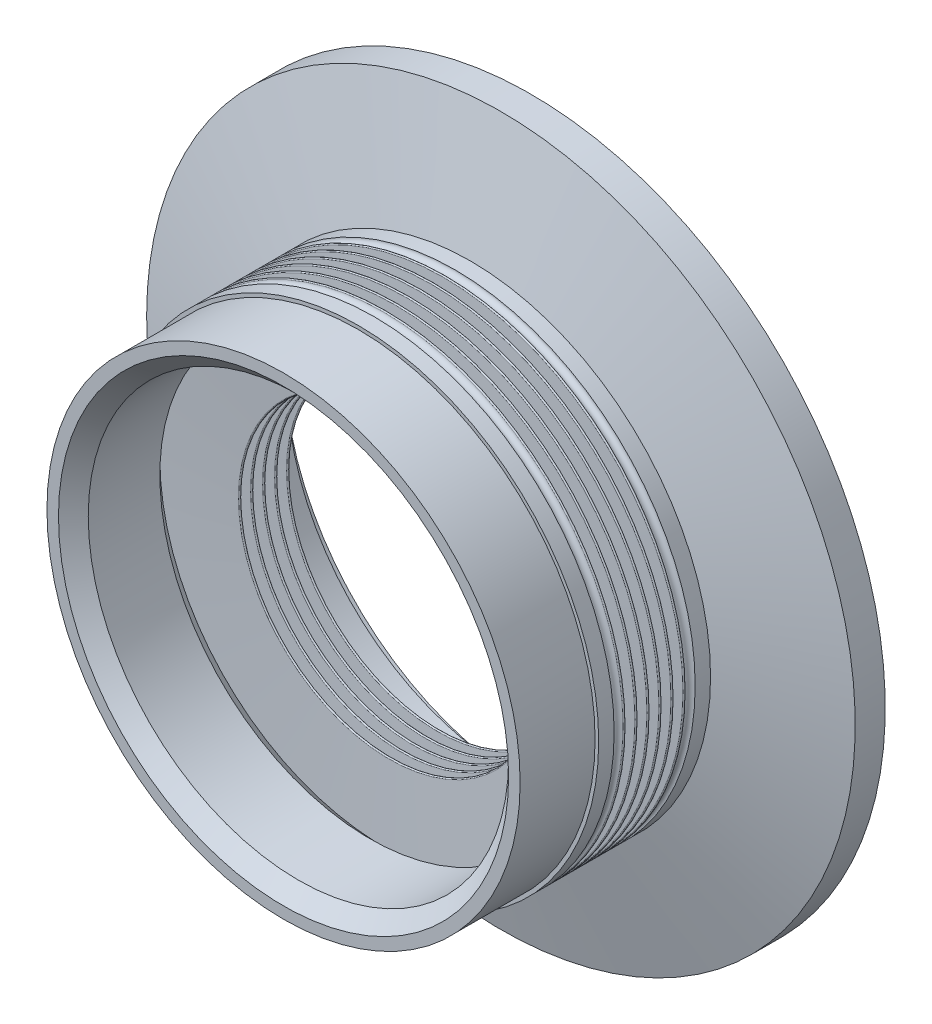
ISO-10303-21;
HEADER;
FILE_DESCRIPTION(('STEP AP214'),'2;1');
FILE_NAME('part.step','',(''),(''),'','','');
FILE_SCHEMA(('AUTOMOTIVE_DESIGN { 1 0 10303 214 1 1 1 1 }'));
ENDSEC;
DATA;
#1=APPLICATION_CONTEXT('core data for automotive mechanical design processes');
#2=APPLICATION_PROTOCOL_DEFINITION('international standard','automotive_design',2000,#1);
#3=PRODUCT_CONTEXT('',#1,'mechanical');
#4=PRODUCT('Part','Part','',(#3));
#5=PRODUCT_RELATED_PRODUCT_CATEGORY('part','',(#4));
#6=PRODUCT_DEFINITION_FORMATION('','',#4);
#7=PRODUCT_DEFINITION_CONTEXT('part definition',#1,'design');
#8=PRODUCT_DEFINITION('design','',#6,#7);
#9=PRODUCT_DEFINITION_SHAPE('','',#8);
#10=(LENGTH_UNIT() NAMED_UNIT(*) SI_UNIT(.MILLI.,.METRE.));
#11=(NAMED_UNIT(*) PLANE_ANGLE_UNIT() SI_UNIT($,.RADIAN.));
#12=(NAMED_UNIT(*) SI_UNIT($,.STERADIAN.) SOLID_ANGLE_UNIT());
#13=UNCERTAINTY_MEASURE_WITH_UNIT(LENGTH_MEASURE(1.E-05),#10,'distance_accuracy_value','');
#14=(GEOMETRIC_REPRESENTATION_CONTEXT(3) GLOBAL_UNCERTAINTY_ASSIGNED_CONTEXT((#13)) GLOBAL_UNIT_ASSIGNED_CONTEXT((#10,
#11,#12)) REPRESENTATION_CONTEXT('',''));
#15=CARTESIAN_POINT('',(0.,0.,0.));
#16=DIRECTION('',(0.,0.,1.));
#17=DIRECTION('',(1.,0.,0.));
#18=AXIS2_PLACEMENT_3D('',#15,#16,#17);
#19=CARTESIAN_POINT('',(0.,0.,0.));
#20=DIRECTION('',(0.,0.,-1.));
#21=DIRECTION('',(-1.,0.,0.));
#22=AXIS2_PLACEMENT_3D('',#19,#20,#21);
#23=TOROIDAL_SURFACE('',#22,25.2984,0.1016);
#24=CARTESIAN_POINT('',(0.,0.,0.101434180557732));
#25=DIRECTION('',(0.,0.,-1.));
#26=DIRECTION('',(-1.,0.,0.));
#27=AXIS2_PLACEMENT_3D('',#24,#25,#26);
#28=CIRCLE('',#27,25.3042023283759);
#29=CARTESIAN_POINT('',(-25.3042023283759,0.,0.101434180557732));
#30=VERTEX_POINT('',#29);
#31=EDGE_CURVE('E73',#30,#30,#28,.T.);
#32=ORIENTED_EDGE('',*,*,#31,.T.);
#33=EDGE_LOOP('',(#32));
#34=FACE_BOUND('',#33,.T.);
#35=CARTESIAN_POINT('',(0.,0.,-0.10017895099382));
#36=DIRECTION('',(0.,0.,-1.));
#37=DIRECTION('',(-1.,0.,0.));
#38=AXIS2_PLACEMENT_3D('',#35,#36,#37);
#39=CIRCLE('',#38,25.3153333333333);
#40=CARTESIAN_POINT('',(-25.3153333333333,0.,-0.10017895099382));
#41=VERTEX_POINT('',#40);
#42=EDGE_CURVE('E151',#41,#41,#39,.T.);
#43=ORIENTED_EDGE('',*,*,#42,.F.);
#44=EDGE_LOOP('',(#43));
#45=FACE_BOUND('',#44,.T.);
#46=ADVANCED_FACE('F44',(#34,#45),#23,.T.);
#47=CARTESIAN_POINT('',(0.,0.,0.533565819442269));
#48=DIRECTION('',(0.,0.,-1.));
#49=DIRECTION('',(-1.,0.,0.));
#50=AXIS2_PLACEMENT_3D('',#47,#48,#49);
#51=CONICAL_SURFACE('',#50,15.9707976716241,1.51365570610989);
#52=CARTESIAN_POINT('',(0.,0.,0.));
#53=DIRECTION('',(0.,0.,1.));
#54=DIRECTION('',(1.,0.,0.));
#55=AXIS2_PLACEMENT_3D('',#52,#53,#54);
#56=CIRCLE('',#55,25.2984000000002);
#57=CARTESIAN_POINT('',(25.2984000000002,0.,0.));
#58=VERTEX_POINT('',#57);
#59=EDGE_CURVE('E148',#58,#58,#56,.T.);
#60=ORIENTED_EDGE('',*,*,#59,.F.);
#61=EDGE_LOOP('',(#60));
#62=FACE_BOUND('',#61,.T.);
#63=CARTESIAN_POINT('',(0.,0.,0.533565819442269));
#64=DIRECTION('',(0.,0.,-1.));
#65=DIRECTION('',(-1.,0.,0.));
#66=AXIS2_PLACEMENT_3D('',#63,#64,#65);
#67=CIRCLE('',#66,15.9707976716241);
#68=CARTESIAN_POINT('',(-15.9707976716241,0.,0.533565819442269));
#69=VERTEX_POINT('',#68);
#70=EDGE_CURVE('E55',#69,#69,#67,.T.);
#71=ORIENTED_EDGE('',*,*,#70,.F.);
#72=EDGE_LOOP('',(#71));
#73=FACE_BOUND('',#72,.T.);
#74=ADVANCED_FACE('F248',(#62,#73),#51,.F.);
#75=CARTESIAN_POINT('',(0.,0.,0.635000000000001));
#76=DIRECTION('',(0.,0.,-1.));
#77=DIRECTION('',(-1.,0.,0.));
#78=AXIS2_PLACEMENT_3D('',#75,#76,#77);
#79=TOROIDAL_SURFACE('',#78,15.9766,0.1016);
#80=ORIENTED_EDGE('',*,*,#70,.T.);
#81=EDGE_LOOP('',(#80));
#82=FACE_BOUND('',#81,.T.);
#83=CARTESIAN_POINT('',(0.,0.,0.736434180557733));
#84=DIRECTION('',(0.,0.,-1.));
#85=DIRECTION('',(-1.,0.,0.));
#86=AXIS2_PLACEMENT_3D('',#83,#84,#85);
#87=CIRCLE('',#86,15.9707976716241);
#88=CARTESIAN_POINT('',(-15.9707976716241,0.,0.736434180557733));
#89=VERTEX_POINT('',#88);
#90=EDGE_CURVE('E59',#89,#89,#87,.T.);
#91=ORIENTED_EDGE('',*,*,#90,.F.);
#92=EDGE_LOOP('',(#91));
#93=FACE_BOUND('',#92,.T.);
#94=ADVANCED_FACE('F253',(#82,#93),#79,.T.);
#95=CARTESIAN_POINT('',(0.,0.,1.27));
#96=DIRECTION('',(0.,0.,1.));
#97=DIRECTION('',(1.,0.,0.));
#98=AXIS2_PLACEMENT_3D('',#95,#96,#97);
#99=CONICAL_SURFACE('',#98,25.2984,1.51365570610989);
#100=ORIENTED_EDGE('',*,*,#90,.T.);
#101=EDGE_LOOP('',(#100));
#102=FACE_BOUND('',#101,.T.);
#103=CARTESIAN_POINT('',(0.,0.,1.27));
#104=DIRECTION('',(0.,0.,-1.));
#105=DIRECTION('',(-1.,0.,0.));
#106=AXIS2_PLACEMENT_3D('',#103,#104,#105);
#107=CIRCLE('',#106,25.2984);
#108=CARTESIAN_POINT('',(-25.2984,0.,1.27));
#109=VERTEX_POINT('',#108);
#110=EDGE_CURVE('E64',#109,#109,#107,.T.);
#111=ORIENTED_EDGE('',*,*,#110,.F.);
#112=EDGE_LOOP('',(#111));
#113=FACE_BOUND('',#112,.T.);
#114=ADVANCED_FACE('F260',(#102,#113),#99,.F.);
#115=CARTESIAN_POINT('',(0.,0.,1.27));
#116=DIRECTION('',(0.,0.,-1.));
#117=DIRECTION('',(-1.,0.,0.));
#118=AXIS2_PLACEMENT_3D('',#115,#116,#117);
#119=TOROIDAL_SURFACE('',#118,25.2984,0.1016);
#120=CARTESIAN_POINT('',(0.,0.,1.16856581944227));
#121=DIRECTION('',(0.,0.,-1.));
#122=DIRECTION('',(-1.,0.,0.));
#123=AXIS2_PLACEMENT_3D('',#120,#121,#122);
#124=CIRCLE('',#123,25.3042023283759);
#125=CARTESIAN_POINT('',(-25.3042023283759,0.,1.16856581944227));
#126=VERTEX_POINT('',#125);
#127=EDGE_CURVE('E67',#126,#126,#124,.T.);
#128=ORIENTED_EDGE('',*,*,#127,.F.);
#129=EDGE_LOOP('',(#128));
#130=FACE_BOUND('',#129,.T.);
#131=CARTESIAN_POINT('',(0.,0.,1.37143418055773));
#132=DIRECTION('',(0.,0.,-1.));
#133=DIRECTION('',(-1.,0.,0.));
#134=AXIS2_PLACEMENT_3D('',#131,#132,#133);
#135=CIRCLE('',#134,25.3042023283759);
#136=CARTESIAN_POINT('',(-25.3042023283759,0.,1.37143418055773));
#137=VERTEX_POINT('',#136);
#138=EDGE_CURVE('E91',#137,#137,#135,.T.);
#139=ORIENTED_EDGE('',*,*,#138,.T.);
#140=EDGE_LOOP('',(#139));
#141=FACE_BOUND('',#140,.T.);
#142=ADVANCED_FACE('F264',(#130,#141),#119,.T.);
#143=CARTESIAN_POINT('',(0.,0.,0.635000000000001));
#144=DIRECTION('',(0.,0.,1.));
#145=DIRECTION('',(1.,0.,0.));
#146=AXIS2_PLACEMENT_3D('',#143,#144,#145);
#147=CONICAL_SURFACE('',#146,15.9766,1.51365570610989);
#148=ORIENTED_EDGE('',*,*,#127,.T.);
#149=EDGE_LOOP('',(#148));
#150=FACE_BOUND('',#149,.T.);
#151=CARTESIAN_POINT('',(0.,0.,0.635000000000001));
#152=DIRECTION('',(0.,0.,-1.));
#153=DIRECTION('',(-1.,0.,0.));
#154=AXIS2_PLACEMENT_3D('',#151,#152,#153);
#155=CIRCLE('',#154,15.9766);
#156=CARTESIAN_POINT('',(-15.9766,0.,0.635000000000001));
#157=VERTEX_POINT('',#156);
#158=EDGE_CURVE('E70',#157,#157,#155,.T.);
#159=ORIENTED_EDGE('',*,*,#158,.F.);
#160=EDGE_LOOP('',(#159));
#161=FACE_BOUND('',#160,.T.);
#162=ADVANCED_FACE('F268',(#150,#161),#147,.T.);
#163=CARTESIAN_POINT('',(0.,0.,0.101434180557732));
#164=DIRECTION('',(0.,0.,-1.));
#165=DIRECTION('',(-1.,0.,0.));
#166=AXIS2_PLACEMENT_3D('',#163,#164,#165);
#167=CONICAL_SURFACE('',#166,25.3042023283759,1.51365570610989);
#168=ORIENTED_EDGE('',*,*,#158,.T.);
#169=EDGE_LOOP('',(#168));
#170=FACE_BOUND('',#169,.T.);
#171=ORIENTED_EDGE('',*,*,#31,.F.);
#172=EDGE_LOOP('',(#171));
#173=FACE_BOUND('',#172,.T.);
#174=ADVANCED_FACE('F272',(#170,#173),#167,.T.);
#175=CARTESIAN_POINT('',(0.,0.,1.80356581944227));
#176=DIRECTION('',(0.,0.,-1.));
#177=DIRECTION('',(-1.,0.,0.));
#178=AXIS2_PLACEMENT_3D('',#175,#176,#177);
#179=CONICAL_SURFACE('',#178,15.9707976716241,1.51365570610989);
#180=ORIENTED_EDGE('',*,*,#110,.T.);
#181=EDGE_LOOP('',(#180));
#182=FACE_BOUND('',#181,.T.);
#183=CARTESIAN_POINT('',(0.,0.,1.80356581944227));
#184=DIRECTION('',(0.,0.,-1.));
#185=DIRECTION('',(-1.,0.,0.));
#186=AXIS2_PLACEMENT_3D('',#183,#184,#185);
#187=CIRCLE('',#186,15.9707976716241);
#188=CARTESIAN_POINT('',(-15.9707976716241,0.,1.80356581944227));
#189=VERTEX_POINT('',#188);
#190=EDGE_CURVE('E76',#189,#189,#187,.T.);
#191=ORIENTED_EDGE('',*,*,#190,.F.);
#192=EDGE_LOOP('',(#191));
#193=FACE_BOUND('',#192,.T.);
#194=ADVANCED_FACE('F276',(#182,#193),#179,.F.);
#195=CARTESIAN_POINT('',(0.,0.,1.905));
#196=DIRECTION('',(0.,0.,-1.));
#197=DIRECTION('',(-1.,0.,0.));
#198=AXIS2_PLACEMENT_3D('',#195,#196,#197);
#199=TOROIDAL_SURFACE('',#198,15.9766,0.1016);
#200=ORIENTED_EDGE('',*,*,#190,.T.);
#201=EDGE_LOOP('',(#200));
#202=FACE_BOUND('',#201,.T.);
#203=CARTESIAN_POINT('',(0.,0.,2.00643418055773));
#204=DIRECTION('',(0.,0.,-1.));
#205=DIRECTION('',(-1.,0.,0.));
#206=AXIS2_PLACEMENT_3D('',#203,#204,#205);
#207=CIRCLE('',#206,15.9707976716241);
#208=CARTESIAN_POINT('',(-15.9707976716241,0.,2.00643418055773));
#209=VERTEX_POINT('',#208);
#210=EDGE_CURVE('E79',#209,#209,#207,.T.);
#211=ORIENTED_EDGE('',*,*,#210,.F.);
#212=EDGE_LOOP('',(#211));
#213=FACE_BOUND('',#212,.T.);
#214=ADVANCED_FACE('F280',(#202,#213),#199,.T.);
#215=CARTESIAN_POINT('',(0.,0.,2.54));
#216=DIRECTION('',(0.,0.,1.));
#217=DIRECTION('',(1.,0.,0.));
#218=AXIS2_PLACEMENT_3D('',#215,#216,#217);
#219=CONICAL_SURFACE('',#218,25.2984,1.51365570610989);
#220=ORIENTED_EDGE('',*,*,#210,.T.);
#221=EDGE_LOOP('',(#220));
#222=FACE_BOUND('',#221,.T.);
#223=CARTESIAN_POINT('',(0.,0.,2.54));
#224=DIRECTION('',(0.,0.,-1.));
#225=DIRECTION('',(-1.,0.,0.));
#226=AXIS2_PLACEMENT_3D('',#223,#224,#225);
#227=CIRCLE('',#226,25.2984);
#228=CARTESIAN_POINT('',(-25.2984,0.,2.54));
#229=VERTEX_POINT('',#228);
#230=EDGE_CURVE('E82',#229,#229,#227,.T.);
#231=ORIENTED_EDGE('',*,*,#230,.F.);
#232=EDGE_LOOP('',(#231));
#233=FACE_BOUND('',#232,.T.);
#234=ADVANCED_FACE('F284',(#222,#233),#219,.F.);
#235=CARTESIAN_POINT('',(0.,0.,2.54));
#236=DIRECTION('',(0.,0.,-1.));
#237=DIRECTION('',(-1.,0.,0.));
#238=AXIS2_PLACEMENT_3D('',#235,#236,#237);
#239=TOROIDAL_SURFACE('',#238,25.2984,0.1016);
#240=CARTESIAN_POINT('',(0.,0.,2.43856581944227));
#241=DIRECTION('',(0.,0.,-1.));
#242=DIRECTION('',(-1.,0.,0.));
#243=AXIS2_PLACEMENT_3D('',#240,#241,#242);
#244=CIRCLE('',#243,25.3042023283759);
#245=CARTESIAN_POINT('',(-25.3042023283759,0.,2.43856581944227));
#246=VERTEX_POINT('',#245);
#247=EDGE_CURVE('E85',#246,#246,#244,.T.);
#248=ORIENTED_EDGE('',*,*,#247,.F.);
#249=EDGE_LOOP('',(#248));
#250=FACE_BOUND('',#249,.T.);
#251=CARTESIAN_POINT('',(0.,0.,2.64143418055773));
#252=DIRECTION('',(0.,0.,-1.));
#253=DIRECTION('',(-1.,0.,0.));
#254=AXIS2_PLACEMENT_3D('',#251,#252,#253);
#255=CIRCLE('',#254,25.3042023283759);
#256=CARTESIAN_POINT('',(-25.3042023283759,0.,2.64143418055773));
#257=VERTEX_POINT('',#256);
#258=EDGE_CURVE('E109',#257,#257,#255,.T.);
#259=ORIENTED_EDGE('',*,*,#258,.T.);
#260=EDGE_LOOP('',(#259));
#261=FACE_BOUND('',#260,.T.);
#262=ADVANCED_FACE('F288',(#250,#261),#239,.T.);
#263=CARTESIAN_POINT('',(0.,0.,1.905));
#264=DIRECTION('',(0.,0.,1.));
#265=DIRECTION('',(1.,0.,0.));
#266=AXIS2_PLACEMENT_3D('',#263,#264,#265);
#267=CONICAL_SURFACE('',#266,15.9766,1.51365570610989);
#268=ORIENTED_EDGE('',*,*,#247,.T.);
#269=EDGE_LOOP('',(#268));
#270=FACE_BOUND('',#269,.T.);
#271=CARTESIAN_POINT('',(0.,0.,1.905));
#272=DIRECTION('',(0.,0.,-1.));
#273=DIRECTION('',(-1.,0.,0.));
#274=AXIS2_PLACEMENT_3D('',#271,#272,#273);
#275=CIRCLE('',#274,15.9766);
#276=CARTESIAN_POINT('',(-15.9766,0.,1.905));
#277=VERTEX_POINT('',#276);
#278=EDGE_CURVE('E88',#277,#277,#275,.T.);
#279=ORIENTED_EDGE('',*,*,#278,.F.);
#280=EDGE_LOOP('',(#279));
#281=FACE_BOUND('',#280,.T.);
#282=ADVANCED_FACE('F292',(#270,#281),#267,.T.);
#283=CARTESIAN_POINT('',(0.,0.,1.37143418055773));
#284=DIRECTION('',(0.,0.,-1.));
#285=DIRECTION('',(-1.,0.,0.));
#286=AXIS2_PLACEMENT_3D('',#283,#284,#285);
#287=CONICAL_SURFACE('',#286,25.3042023283759,1.51365570610989);
#288=ORIENTED_EDGE('',*,*,#278,.T.);
#289=EDGE_LOOP('',(#288));
#290=FACE_BOUND('',#289,.T.);
#291=ORIENTED_EDGE('',*,*,#138,.F.);
#292=EDGE_LOOP('',(#291));
#293=FACE_BOUND('',#292,.T.);
#294=ADVANCED_FACE('F296',(#290,#293),#287,.T.);
#295=CARTESIAN_POINT('',(0.,0.,3.07356581944227));
#296=DIRECTION('',(0.,0.,-1.));
#297=DIRECTION('',(-1.,0.,0.));
#298=AXIS2_PLACEMENT_3D('',#295,#296,#297);
#299=CONICAL_SURFACE('',#298,15.9707976716241,1.51365570610989);
#300=ORIENTED_EDGE('',*,*,#230,.T.);
#301=EDGE_LOOP('',(#300));
#302=FACE_BOUND('',#301,.T.);
#303=CARTESIAN_POINT('',(0.,0.,3.07356581944227));
#304=DIRECTION('',(0.,0.,-1.));
#305=DIRECTION('',(-1.,0.,0.));
#306=AXIS2_PLACEMENT_3D('',#303,#304,#305);
#307=CIRCLE('',#306,15.9707976716241);
#308=CARTESIAN_POINT('',(-15.9707976716241,0.,3.07356581944227));
#309=VERTEX_POINT('',#308);
#310=EDGE_CURVE('E94',#309,#309,#307,.T.);
#311=ORIENTED_EDGE('',*,*,#310,.F.);
#312=EDGE_LOOP('',(#311));
#313=FACE_BOUND('',#312,.T.);
#314=ADVANCED_FACE('F300',(#302,#313),#299,.F.);
#315=CARTESIAN_POINT('',(0.,0.,3.175));
#316=DIRECTION('',(0.,0.,-1.));
#317=DIRECTION('',(-1.,0.,0.));
#318=AXIS2_PLACEMENT_3D('',#315,#316,#317);
#319=TOROIDAL_SURFACE('',#318,15.9766,0.1016);
#320=ORIENTED_EDGE('',*,*,#310,.T.);
#321=EDGE_LOOP('',(#320));
#322=FACE_BOUND('',#321,.T.);
#323=CARTESIAN_POINT('',(0.,0.,3.27643418055773));
#324=DIRECTION('',(0.,0.,-1.));
#325=DIRECTION('',(-1.,0.,0.));
#326=AXIS2_PLACEMENT_3D('',#323,#324,#325);
#327=CIRCLE('',#326,15.9707976716241);
#328=CARTESIAN_POINT('',(-15.9707976716241,0.,3.27643418055773));
#329=VERTEX_POINT('',#328);
#330=EDGE_CURVE('E97',#329,#329,#327,.T.);
#331=ORIENTED_EDGE('',*,*,#330,.F.);
#332=EDGE_LOOP('',(#331));
#333=FACE_BOUND('',#332,.T.);
#334=ADVANCED_FACE('F304',(#322,#333),#319,.T.);
#335=CARTESIAN_POINT('',(0.,0.,3.81));
#336=DIRECTION('',(0.,0.,1.));
#337=DIRECTION('',(1.,0.,0.));
#338=AXIS2_PLACEMENT_3D('',#335,#336,#337);
#339=CONICAL_SURFACE('',#338,25.2984,1.51365570610989);
#340=ORIENTED_EDGE('',*,*,#330,.T.);
#341=EDGE_LOOP('',(#340));
#342=FACE_BOUND('',#341,.T.);
#343=CARTESIAN_POINT('',(0.,0.,3.81));
#344=DIRECTION('',(0.,0.,-1.));
#345=DIRECTION('',(-1.,0.,0.));
#346=AXIS2_PLACEMENT_3D('',#343,#344,#345);
#347=CIRCLE('',#346,25.2984);
#348=CARTESIAN_POINT('',(-25.2984,0.,3.81));
#349=VERTEX_POINT('',#348);
#350=EDGE_CURVE('E100',#349,#349,#347,.T.);
#351=ORIENTED_EDGE('',*,*,#350,.F.);
#352=EDGE_LOOP('',(#351));
#353=FACE_BOUND('',#352,.T.);
#354=ADVANCED_FACE('F308',(#342,#353),#339,.F.);
#355=CARTESIAN_POINT('',(0.,0.,3.81));
#356=DIRECTION('',(0.,0.,-1.));
#357=DIRECTION('',(-1.,0.,0.));
#358=AXIS2_PLACEMENT_3D('',#355,#356,#357);
#359=TOROIDAL_SURFACE('',#358,25.2984,0.1016);
#360=CARTESIAN_POINT('',(0.,0.,3.70856581944227));
#361=DIRECTION('',(0.,0.,-1.));
#362=DIRECTION('',(-1.,0.,0.));
#363=AXIS2_PLACEMENT_3D('',#360,#361,#362);
#364=CIRCLE('',#363,25.3042023283759);
#365=CARTESIAN_POINT('',(-25.3042023283759,0.,3.70856581944227));
#366=VERTEX_POINT('',#365);
#367=EDGE_CURVE('E103',#366,#366,#364,.T.);
#368=ORIENTED_EDGE('',*,*,#367,.F.);
#369=EDGE_LOOP('',(#368));
#370=FACE_BOUND('',#369,.T.);
#371=CARTESIAN_POINT('',(0.,0.,3.91143418055773));
#372=DIRECTION('',(0.,0.,-1.));
#373=DIRECTION('',(-1.,0.,0.));
#374=AXIS2_PLACEMENT_3D('',#371,#372,#373);
#375=CIRCLE('',#374,25.3042023283759);
#376=CARTESIAN_POINT('',(-25.3042023283759,0.,3.91143418055773));
#377=VERTEX_POINT('',#376);
#378=EDGE_CURVE('E127',#377,#377,#375,.T.);
#379=ORIENTED_EDGE('',*,*,#378,.T.);
#380=EDGE_LOOP('',(#379));
#381=FACE_BOUND('',#380,.T.);
#382=ADVANCED_FACE('F312',(#370,#381),#359,.T.);
#383=CARTESIAN_POINT('',(0.,0.,3.175));
#384=DIRECTION('',(0.,0.,1.));
#385=DIRECTION('',(1.,0.,0.));
#386=AXIS2_PLACEMENT_3D('',#383,#384,#385);
#387=CONICAL_SURFACE('',#386,15.9766,1.51365570610989);
#388=ORIENTED_EDGE('',*,*,#367,.T.);
#389=EDGE_LOOP('',(#388));
#390=FACE_BOUND('',#389,.T.);
#391=CARTESIAN_POINT('',(0.,0.,3.175));
#392=DIRECTION('',(0.,0.,-1.));
#393=DIRECTION('',(-1.,0.,0.));
#394=AXIS2_PLACEMENT_3D('',#391,#392,#393);
#395=CIRCLE('',#394,15.9766);
#396=CARTESIAN_POINT('',(-15.9766,0.,3.175));
#397=VERTEX_POINT('',#396);
#398=EDGE_CURVE('E106',#397,#397,#395,.T.);
#399=ORIENTED_EDGE('',*,*,#398,.F.);
#400=EDGE_LOOP('',(#399));
#401=FACE_BOUND('',#400,.T.);
#402=ADVANCED_FACE('F316',(#390,#401),#387,.T.);
#403=CARTESIAN_POINT('',(0.,0.,2.64143418055773));
#404=DIRECTION('',(0.,0.,-1.));
#405=DIRECTION('',(-1.,0.,0.));
#406=AXIS2_PLACEMENT_3D('',#403,#404,#405);
#407=CONICAL_SURFACE('',#406,25.3042023283759,1.51365570610989);
#408=ORIENTED_EDGE('',*,*,#398,.T.);
#409=EDGE_LOOP('',(#408));
#410=FACE_BOUND('',#409,.T.);
#411=ORIENTED_EDGE('',*,*,#258,.F.);
#412=EDGE_LOOP('',(#411));
#413=FACE_BOUND('',#412,.T.);
#414=ADVANCED_FACE('F320',(#410,#413),#407,.T.);
#415=CARTESIAN_POINT('',(0.,0.,4.34356581944227));
#416=DIRECTION('',(0.,0.,-1.));
#417=DIRECTION('',(-1.,0.,0.));
#418=AXIS2_PLACEMENT_3D('',#415,#416,#417);
#419=CONICAL_SURFACE('',#418,15.9707976716241,1.51365570610989);
#420=ORIENTED_EDGE('',*,*,#350,.T.);
#421=EDGE_LOOP('',(#420));
#422=FACE_BOUND('',#421,.T.);
#423=CARTESIAN_POINT('',(0.,0.,4.34356581944227));
#424=DIRECTION('',(0.,0.,-1.));
#425=DIRECTION('',(-1.,0.,0.));
#426=AXIS2_PLACEMENT_3D('',#423,#424,#425);
#427=CIRCLE('',#426,15.9707976716241);
#428=CARTESIAN_POINT('',(-15.9707976716241,0.,4.34356581944227));
#429=VERTEX_POINT('',#428);
#430=EDGE_CURVE('E112',#429,#429,#427,.T.);
#431=ORIENTED_EDGE('',*,*,#430,.F.);
#432=EDGE_LOOP('',(#431));
#433=FACE_BOUND('',#432,.T.);
#434=ADVANCED_FACE('F324',(#422,#433),#419,.F.);
#435=CARTESIAN_POINT('',(0.,0.,4.445));
#436=DIRECTION('',(0.,0.,-1.));
#437=DIRECTION('',(-1.,0.,0.));
#438=AXIS2_PLACEMENT_3D('',#435,#436,#437);
#439=TOROIDAL_SURFACE('',#438,15.9766,0.1016);
#440=ORIENTED_EDGE('',*,*,#430,.T.);
#441=EDGE_LOOP('',(#440));
#442=FACE_BOUND('',#441,.T.);
#443=CARTESIAN_POINT('',(0.,0.,4.54643418055773));
#444=DIRECTION('',(0.,0.,-1.));
#445=DIRECTION('',(-1.,0.,0.));
#446=AXIS2_PLACEMENT_3D('',#443,#444,#445);
#447=CIRCLE('',#446,15.9707976716241);
#448=CARTESIAN_POINT('',(-15.9707976716241,0.,4.54643418055773));
#449=VERTEX_POINT('',#448);
#450=EDGE_CURVE('E115',#449,#449,#447,.T.);
#451=ORIENTED_EDGE('',*,*,#450,.F.);
#452=EDGE_LOOP('',(#451));
#453=FACE_BOUND('',#452,.T.);
#454=ADVANCED_FACE('F328',(#442,#453),#439,.T.);
#455=CARTESIAN_POINT('',(0.,0.,5.08));
#456=DIRECTION('',(0.,0.,1.));
#457=DIRECTION('',(1.,0.,0.));
#458=AXIS2_PLACEMENT_3D('',#455,#456,#457);
#459=CONICAL_SURFACE('',#458,25.2984,1.51365570610989);
#460=ORIENTED_EDGE('',*,*,#450,.T.);
#461=EDGE_LOOP('',(#460));
#462=FACE_BOUND('',#461,.T.);
#463=CARTESIAN_POINT('',(0.,0.,5.08));
#464=DIRECTION('',(0.,0.,-1.));
#465=DIRECTION('',(-1.,0.,0.));
#466=AXIS2_PLACEMENT_3D('',#463,#464,#465);
#467=CIRCLE('',#466,25.2984);
#468=CARTESIAN_POINT('',(-25.2984,0.,5.08));
#469=VERTEX_POINT('',#468);
#470=EDGE_CURVE('E118',#469,#469,#467,.T.);
#471=ORIENTED_EDGE('',*,*,#470,.F.);
#472=EDGE_LOOP('',(#471));
#473=FACE_BOUND('',#472,.T.);
#474=ADVANCED_FACE('F332',(#462,#473),#459,.F.);
#475=CARTESIAN_POINT('',(0.,0.,5.08));
#476=DIRECTION('',(0.,0.,-1.));
#477=DIRECTION('',(-1.,0.,0.));
#478=AXIS2_PLACEMENT_3D('',#475,#476,#477);
#479=TOROIDAL_SURFACE('',#478,25.2984,0.1016);
#480=CARTESIAN_POINT('',(0.,0.,4.97856581944227));
#481=DIRECTION('',(0.,0.,-1.));
#482=DIRECTION('',(-1.,0.,0.));
#483=AXIS2_PLACEMENT_3D('',#480,#481,#482);
#484=CIRCLE('',#483,25.3042023283759);
#485=CARTESIAN_POINT('',(-25.3042023283759,0.,4.97856581944227));
#486=VERTEX_POINT('',#485);
#487=EDGE_CURVE('E121',#486,#486,#484,.T.);
#488=ORIENTED_EDGE('',*,*,#487,.F.);
#489=EDGE_LOOP('',(#488));
#490=FACE_BOUND('',#489,.T.);
#491=CARTESIAN_POINT('',(0.,0.,5.18143418055773));
#492=DIRECTION('',(0.,0.,-1.));
#493=DIRECTION('',(-1.,0.,0.));
#494=AXIS2_PLACEMENT_3D('',#491,#492,#493);
#495=CIRCLE('',#494,25.3042023283759);
#496=CARTESIAN_POINT('',(-25.3042023283759,0.,5.18143418055773));
#497=VERTEX_POINT('',#496);
#498=EDGE_CURVE('E145',#497,#497,#495,.T.);
#499=ORIENTED_EDGE('',*,*,#498,.T.);
#500=EDGE_LOOP('',(#499));
#501=FACE_BOUND('',#500,.T.);
#502=ADVANCED_FACE('F336',(#490,#501),#479,.T.);
#503=CARTESIAN_POINT('',(0.,0.,4.445));
#504=DIRECTION('',(0.,0.,1.));
#505=DIRECTION('',(1.,0.,0.));
#506=AXIS2_PLACEMENT_3D('',#503,#504,#505);
#507=CONICAL_SURFACE('',#506,15.9766,1.51365570610989);
#508=ORIENTED_EDGE('',*,*,#487,.T.);
#509=EDGE_LOOP('',(#508));
#510=FACE_BOUND('',#509,.T.);
#511=CARTESIAN_POINT('',(0.,0.,4.445));
#512=DIRECTION('',(0.,0.,-1.));
#513=DIRECTION('',(-1.,0.,0.));
#514=AXIS2_PLACEMENT_3D('',#511,#512,#513);
#515=CIRCLE('',#514,15.9766);
#516=CARTESIAN_POINT('',(-15.9766,0.,4.445));
#517=VERTEX_POINT('',#516);
#518=EDGE_CURVE('E124',#517,#517,#515,.T.);
#519=ORIENTED_EDGE('',*,*,#518,.F.);
#520=EDGE_LOOP('',(#519));
#521=FACE_BOUND('',#520,.T.);
#522=ADVANCED_FACE('F340',(#510,#521),#507,.T.);
#523=CARTESIAN_POINT('',(0.,0.,3.91143418055773));
#524=DIRECTION('',(0.,0.,-1.));
#525=DIRECTION('',(-1.,0.,0.));
#526=AXIS2_PLACEMENT_3D('',#523,#524,#525);
#527=CONICAL_SURFACE('',#526,25.3042023283759,1.51365570610989);
#528=ORIENTED_EDGE('',*,*,#518,.T.);
#529=EDGE_LOOP('',(#528));
#530=FACE_BOUND('',#529,.T.);
#531=ORIENTED_EDGE('',*,*,#378,.F.);
#532=EDGE_LOOP('',(#531));
#533=FACE_BOUND('',#532,.T.);
#534=ADVANCED_FACE('F344',(#530,#533),#527,.T.);
#535=CARTESIAN_POINT('',(0.,0.,5.61356581944227));
#536=DIRECTION('',(0.,0.,-1.));
#537=DIRECTION('',(-1.,0.,0.));
#538=AXIS2_PLACEMENT_3D('',#535,#536,#537);
#539=CONICAL_SURFACE('',#538,15.9707976716241,1.51365570610989);
#540=ORIENTED_EDGE('',*,*,#470,.T.);
#541=EDGE_LOOP('',(#540));
#542=FACE_BOUND('',#541,.T.);
#543=CARTESIAN_POINT('',(0.,0.,5.61356581944227));
#544=DIRECTION('',(0.,0.,-1.));
#545=DIRECTION('',(-1.,0.,0.));
#546=AXIS2_PLACEMENT_3D('',#543,#544,#545);
#547=CIRCLE('',#546,15.9707976716241);
#548=CARTESIAN_POINT('',(-15.9707976716241,0.,5.61356581944227));
#549=VERTEX_POINT('',#548);
#550=EDGE_CURVE('E130',#549,#549,#547,.T.);
#551=ORIENTED_EDGE('',*,*,#550,.F.);
#552=EDGE_LOOP('',(#551));
#553=FACE_BOUND('',#552,.T.);
#554=ADVANCED_FACE('F348',(#542,#553),#539,.F.);
#555=CARTESIAN_POINT('',(0.,0.,5.715));
#556=DIRECTION('',(0.,0.,-1.));
#557=DIRECTION('',(-1.,0.,0.));
#558=AXIS2_PLACEMENT_3D('',#555,#556,#557);
#559=TOROIDAL_SURFACE('',#558,15.9766,0.1016);
#560=ORIENTED_EDGE('',*,*,#550,.T.);
#561=EDGE_LOOP('',(#560));
#562=FACE_BOUND('',#561,.T.);
#563=CARTESIAN_POINT('',(0.,0.,5.81643418055773));
#564=DIRECTION('',(0.,0.,-1.));
#565=DIRECTION('',(-1.,0.,0.));
#566=AXIS2_PLACEMENT_3D('',#563,#564,#565);
#567=CIRCLE('',#566,15.9707976716241);
#568=CARTESIAN_POINT('',(-15.9707976716241,0.,5.81643418055773));
#569=VERTEX_POINT('',#568);
#570=EDGE_CURVE('E133',#569,#569,#567,.T.);
#571=ORIENTED_EDGE('',*,*,#570,.F.);
#572=EDGE_LOOP('',(#571));
#573=FACE_BOUND('',#572,.T.);
#574=ADVANCED_FACE('F243',(#562,#573),#559,.T.);
#575=CARTESIAN_POINT('',(0.,0.,6.35));
#576=DIRECTION('',(0.,0.,1.));
#577=DIRECTION('',(1.,0.,0.));
#578=AXIS2_PLACEMENT_3D('',#575,#576,#577);
#579=CONICAL_SURFACE('',#578,25.2984,1.51365570610989);
#580=ORIENTED_EDGE('',*,*,#570,.T.);
#581=EDGE_LOOP('',(#580));
#582=FACE_BOUND('',#581,.T.);
#583=CARTESIAN_POINT('',(0.,0.,6.35));
#584=DIRECTION('',(0.,0.,-1.));
#585=DIRECTION('',(-1.,0.,0.));
#586=AXIS2_PLACEMENT_3D('',#583,#584,#585);
#587=CIRCLE('',#586,25.2984);
#588=CARTESIAN_POINT('',(-25.2984,0.,6.35));
#589=VERTEX_POINT('',#588);
#590=EDGE_CURVE('E136',#589,#589,#587,.T.);
#591=ORIENTED_EDGE('',*,*,#590,.F.);
#592=EDGE_LOOP('',(#591));
#593=FACE_BOUND('',#592,.T.);
#594=ADVANCED_FACE('F233',(#582,#593),#579,.F.);
#595=CARTESIAN_POINT('',(0.,0.,6.35));
#596=DIRECTION('',(0.,0.,-1.));
#597=DIRECTION('',(-1.,0.,0.));
#598=AXIS2_PLACEMENT_3D('',#595,#596,#597);
#599=TOROIDAL_SURFACE('',#598,25.2984,0.1016);
#600=CARTESIAN_POINT('',(0.,0.,6.24856581944227));
#601=DIRECTION('',(0.,0.,-1.));
#602=DIRECTION('',(-1.,0.,0.));
#603=AXIS2_PLACEMENT_3D('',#600,#601,#602);
#604=CIRCLE('',#603,25.3042023283759);
#605=CARTESIAN_POINT('',(-25.3042023283759,0.,6.24856581944227));
#606=VERTEX_POINT('',#605);
#607=EDGE_CURVE('E139',#606,#606,#604,.T.);
#608=ORIENTED_EDGE('',*,*,#607,.F.);
#609=EDGE_LOOP('',(#608));
#610=FACE_BOUND('',#609,.T.);
#611=CARTESIAN_POINT('',(0.,0.,6.45017895099382));
#612=DIRECTION('',(0.,0.,1.));
#613=DIRECTION('',(1.,0.,0.));
#614=AXIS2_PLACEMENT_3D('',#611,#612,#613);
#615=CIRCLE('',#614,25.3153333333333);
#616=CARTESIAN_POINT('',(25.3153333333333,0.,6.45017895099382));
#617=VERTEX_POINT('',#616);
#618=EDGE_CURVE('E187',#617,#617,#615,.T.);
#619=ORIENTED_EDGE('',*,*,#618,.F.);
#620=EDGE_LOOP('',(#619));
#621=FACE_BOUND('',#620,.T.);
#622=ADVANCED_FACE('F230',(#610,#621),#599,.T.);
#623=CARTESIAN_POINT('',(0.,0.,5.715));
#624=DIRECTION('',(0.,0.,1.));
#625=DIRECTION('',(1.,0.,0.));
#626=AXIS2_PLACEMENT_3D('',#623,#624,#625);
#627=CONICAL_SURFACE('',#626,15.9766,1.51365570610989);
#628=ORIENTED_EDGE('',*,*,#607,.T.);
#629=EDGE_LOOP('',(#628));
#630=FACE_BOUND('',#629,.T.);
#631=CARTESIAN_POINT('',(0.,0.,5.715));
#632=DIRECTION('',(0.,0.,-1.));
#633=DIRECTION('',(-1.,0.,0.));
#634=AXIS2_PLACEMENT_3D('',#631,#632,#633);
#635=CIRCLE('',#634,15.9766);
#636=CARTESIAN_POINT('',(-15.9766,0.,5.715));
#637=VERTEX_POINT('',#636);
#638=EDGE_CURVE('E142',#637,#637,#635,.T.);
#639=ORIENTED_EDGE('',*,*,#638,.F.);
#640=EDGE_LOOP('',(#639));
#641=FACE_BOUND('',#640,.T.);
#642=ADVANCED_FACE('F232',(#630,#641),#627,.T.);
#643=CARTESIAN_POINT('',(0.,0.,5.18143418055773));
#644=DIRECTION('',(0.,0.,-1.));
#645=DIRECTION('',(-1.,0.,0.));
#646=AXIS2_PLACEMENT_3D('',#643,#644,#645);
#647=CONICAL_SURFACE('',#646,25.3042023283759,1.51365570610989);
#648=ORIENTED_EDGE('',*,*,#638,.T.);
#649=EDGE_LOOP('',(#648));
#650=FACE_BOUND('',#649,.T.);
#651=ORIENTED_EDGE('',*,*,#498,.F.);
#652=EDGE_LOOP('',(#651));
#653=FACE_BOUND('',#652,.T.);
#654=ADVANCED_FACE('F240',(#650,#653),#647,.T.);
#655=CARTESIAN_POINT('',(0.,0.,-0.60107370596292));
#656=DIRECTION('',(0.,0.,-1.));
#657=DIRECTION('',(-1.,0.,0.));
#658=AXIS2_PLACEMENT_3D('',#655,#656,#657);
#659=TOROIDAL_SURFACE('',#658,25.4,0.508);
#660=ORIENTED_EDGE('',*,*,#42,.T.);
#661=EDGE_LOOP('',(#660));
#662=FACE_BOUND('',#661,.T.);
#663=CARTESIAN_POINT('',(0.,0.,-1.10907370596292));
#664=DIRECTION('',(0.,0.,-1.));
#665=DIRECTION('',(-1.,0.,0.));
#666=AXIS2_PLACEMENT_3D('',#663,#664,#665);
#667=CIRCLE('',#666,25.4);
#668=CARTESIAN_POINT('',(-25.4,0.,-1.10907370596292));
#669=VERTEX_POINT('',#668);
#670=EDGE_CURVE('E178',#669,#669,#667,.T.);
#671=ORIENTED_EDGE('',*,*,#670,.F.);
#672=EDGE_LOOP('',(#671));
#673=FACE_BOUND('',#672,.T.);
#674=ADVANCED_FACE('F415',(#662,#673),#659,.F.);
#675=CARTESIAN_POINT('',(0.,24.511,0.));
#676=DIRECTION('',(0.,0.,1.));
#677=DIRECTION('',(1.,0.,0.));
#678=AXIS2_PLACEMENT_3D('',#675,#676,#677);
#679=PLANE('',#678);
#680=ORIENTED_EDGE('',*,*,#59,.T.);
#681=EDGE_LOOP('',(#680));
#682=FACE_BOUND('',#681,.T.);
#683=CARTESIAN_POINT('',(0.,0.,0.));
#684=DIRECTION('',(0.,0.,-1.));
#685=DIRECTION('',(-1.,0.,0.));
#686=AXIS2_PLACEMENT_3D('',#683,#684,#685);
#687=CIRCLE('',#686,24.511);
#688=CARTESIAN_POINT('',(-24.511,0.,0.));
#689=VERTEX_POINT('',#688);
#690=EDGE_CURVE('E154',#689,#689,#687,.T.);
#691=ORIENTED_EDGE('',*,*,#690,.T.);
#692=EDGE_LOOP('',(#691));
#693=FACE_BOUND('',#692,.T.);
#694=ADVANCED_FACE('F411',(#682,#693),#679,.T.);
#695=CARTESIAN_POINT('',(0.,0.,0.));
#696=DIRECTION('',(0.,0.,1.));
#697=DIRECTION('',(1.,0.,0.));
#698=AXIS2_PLACEMENT_3D('',#695,#696,#697);
#699=CONICAL_SURFACE('',#698,24.511,0.785398163397454);
#700=CARTESIAN_POINT('',(0.,0.,-0.762000000000001));
#701=DIRECTION('',(0.,0.,-1.));
#702=DIRECTION('',(-1.,0.,0.));
#703=AXIS2_PLACEMENT_3D('',#700,#701,#702);
#704=CIRCLE('',#703,23.749);
#705=CARTESIAN_POINT('',(-23.749,0.,-0.762000000000001));
#706=VERTEX_POINT('',#705);
#707=EDGE_CURVE('E157',#706,#706,#704,.T.);
#708=ORIENTED_EDGE('',*,*,#707,.T.);
#709=EDGE_LOOP('',(#708));
#710=FACE_BOUND('',#709,.T.);
#711=ORIENTED_EDGE('',*,*,#690,.F.);
#712=EDGE_LOOP('',(#711));
#713=FACE_BOUND('',#712,.T.);
#714=ADVANCED_FACE('F407',(#710,#713),#699,.F.);
#715=CARTESIAN_POINT('',(0.,0.,7.79451367293446));
#716=DIRECTION('',(0.,0.,-1.));
#717=DIRECTION('',(-1.,0.,0.));
#718=AXIS2_PLACEMENT_3D('',#715,#716,#717);
#719=CYLINDRICAL_SURFACE('',#718,23.749);
#720=CARTESIAN_POINT('',(0.,0.,-7.112));
#721=DIRECTION('',(0.,0.,-1.));
#722=DIRECTION('',(-1.,0.,0.));
#723=AXIS2_PLACEMENT_3D('',#720,#721,#722);
#724=CIRCLE('',#723,23.749);
#725=CARTESIAN_POINT('',(-23.749,0.,-7.112));
#726=VERTEX_POINT('',#725);
#727=EDGE_CURVE('E160',#726,#726,#724,.T.);
#728=ORIENTED_EDGE('',*,*,#727,.T.);
#729=EDGE_LOOP('',(#728));
#730=FACE_BOUND('',#729,.T.);
#731=ORIENTED_EDGE('',*,*,#707,.F.);
#732=EDGE_LOOP('',(#731));
#733=FACE_BOUND('',#732,.T.);
#734=ADVANCED_FACE('F403',(#730,#733),#719,.F.);
#735=CARTESIAN_POINT('',(0.,26.1112,-7.112));
#736=DIRECTION('',(0.,0.,-1.));
#737=DIRECTION('',(-1.,0.,0.));
#738=AXIS2_PLACEMENT_3D('',#735,#736,#737);
#739=PLANE('',#738);
#740=CARTESIAN_POINT('',(0.,0.,-7.112));
#741=DIRECTION('',(0.,0.,-1.));
#742=DIRECTION('',(-1.,0.,0.));
#743=AXIS2_PLACEMENT_3D('',#740,#741,#742);
#744=CIRCLE('',#743,26.1112);
#745=CARTESIAN_POINT('',(-26.1112,0.,-7.112));
#746=VERTEX_POINT('',#745);
#747=EDGE_CURVE('E163',#746,#746,#744,.T.);
#748=ORIENTED_EDGE('',*,*,#747,.T.);
#749=EDGE_LOOP('',(#748));
#750=FACE_BOUND('',#749,.T.);
#751=ORIENTED_EDGE('',*,*,#727,.F.);
#752=EDGE_LOOP('',(#751));
#753=FACE_BOUND('',#752,.T.);
#754=ADVANCED_FACE('F399',(#750,#753),#739,.T.);
#755=CARTESIAN_POINT('',(0.,0.,7.79451367293446));
#756=DIRECTION('',(0.,0.,-1.));
#757=DIRECTION('',(-1.,0.,0.));
#758=AXIS2_PLACEMENT_3D('',#755,#756,#757);
#759=CYLINDRICAL_SURFACE('',#758,26.1112);
#760=CARTESIAN_POINT('',(0.,0.,-9.144));
#761=DIRECTION('',(0.,0.,-1.));
#762=DIRECTION('',(-1.,0.,0.));
#763=AXIS2_PLACEMENT_3D('',#760,#761,#762);
#764=CIRCLE('',#763,26.1112);
#765=CARTESIAN_POINT('',(-26.1112,0.,-9.144));
#766=VERTEX_POINT('',#765);
#767=EDGE_CURVE('E166',#766,#766,#764,.T.);
#768=ORIENTED_EDGE('',*,*,#767,.T.);
#769=EDGE_LOOP('',(#768));
#770=FACE_BOUND('',#769,.T.);
#771=ORIENTED_EDGE('',*,*,#747,.F.);
#772=EDGE_LOOP('',(#771));
#773=FACE_BOUND('',#772,.T.);
#774=ADVANCED_FACE('F395',(#770,#773),#759,.F.);
#775=CARTESIAN_POINT('',(0.,37.465,-9.144));
#776=DIRECTION('',(0.,0.,-1.));
#777=DIRECTION('',(-1.,0.,0.));
#778=AXIS2_PLACEMENT_3D('',#775,#776,#777);
#779=PLANE('',#778);
#780=CARTESIAN_POINT('',(0.,0.,-9.144));
#781=DIRECTION('',(0.,0.,-1.));
#782=DIRECTION('',(-1.,0.,0.));
#783=AXIS2_PLACEMENT_3D('',#780,#781,#782);
#784=CIRCLE('',#783,37.465);
#785=CARTESIAN_POINT('',(-37.465,0.,-9.144));
#786=VERTEX_POINT('',#785);
#787=EDGE_CURVE('E169',#786,#786,#784,.T.);
#788=ORIENTED_EDGE('',*,*,#787,.T.);
#789=EDGE_LOOP('',(#788));
#790=FACE_BOUND('',#789,.T.);
#791=ORIENTED_EDGE('',*,*,#767,.F.);
#792=EDGE_LOOP('',(#791));
#793=FACE_BOUND('',#792,.T.);
#794=ADVANCED_FACE('F391',(#790,#793),#779,.T.);
#795=CARTESIAN_POINT('',(0.,0.,7.79451367293446));
#796=DIRECTION('',(0.,0.,-1.));
#797=DIRECTION('',(-1.,0.,0.));
#798=AXIS2_PLACEMENT_3D('',#795,#796,#797);
#799=CYLINDRICAL_SURFACE('',#798,37.465);
#800=CARTESIAN_POINT('',(0.,0.,-5.969));
#801=DIRECTION('',(0.,0.,-1.));
#802=DIRECTION('',(-1.,0.,0.));
#803=AXIS2_PLACEMENT_3D('',#800,#801,#802);
#804=CIRCLE('',#803,37.465);
#805=CARTESIAN_POINT('',(-37.465,0.,-5.969));
#806=VERTEX_POINT('',#805);
#807=EDGE_CURVE('E172',#806,#806,#804,.T.);
#808=ORIENTED_EDGE('',*,*,#807,.T.);
#809=EDGE_LOOP('',(#808));
#810=FACE_BOUND('',#809,.T.);
#811=ORIENTED_EDGE('',*,*,#787,.F.);
#812=EDGE_LOOP('',(#811));
#813=FACE_BOUND('',#812,.T.);
#814=ADVANCED_FACE('F387',(#810,#813),#799,.T.);
#815=CARTESIAN_POINT('',(0.,0.,-5.969));
#816=DIRECTION('',(0.,0.,-1.));
#817=DIRECTION('',(-1.,0.,0.));
#818=AXIS2_PLACEMENT_3D('',#815,#816,#817);
#819=CONICAL_SURFACE('',#818,37.465,1.30899693899575);
#820=CARTESIAN_POINT('',(0.,0.,-2.73619299331859));
#821=DIRECTION('',(0.,0.,-1.));
#822=DIRECTION('',(-1.,0.,0.));
#823=AXIS2_PLACEMENT_3D('',#820,#821,#822);
#824=CIRCLE('',#823,25.4);
#825=CARTESIAN_POINT('',(-25.4,0.,-2.73619299331859));
#826=VERTEX_POINT('',#825);
#827=EDGE_CURVE('E175',#826,#826,#824,.T.);
#828=ORIENTED_EDGE('',*,*,#827,.T.);
#829=EDGE_LOOP('',(#828));
#830=FACE_BOUND('',#829,.T.);
#831=ORIENTED_EDGE('',*,*,#807,.F.);
#832=EDGE_LOOP('',(#831));
#833=FACE_BOUND('',#832,.T.);
#834=ADVANCED_FACE('F381',(#830,#833),#819,.T.);
#835=CARTESIAN_POINT('',(0.,0.,7.79451367293446));
#836=DIRECTION('',(0.,0.,-1.));
#837=DIRECTION('',(-1.,0.,0.));
#838=AXIS2_PLACEMENT_3D('',#835,#836,#837);
#839=CYLINDRICAL_SURFACE('',#838,25.4);
#840=ORIENTED_EDGE('',*,*,#670,.T.);
#841=EDGE_LOOP('',(#840));
#842=FACE_BOUND('',#841,.T.);
#843=ORIENTED_EDGE('',*,*,#827,.F.);
#844=EDGE_LOOP('',(#843));
#845=FACE_BOUND('',#844,.T.);
#846=ADVANCED_FACE('F376',(#842,#845),#839,.T.);
#847=CARTESIAN_POINT('',(0.,0.,34.4131580077303));
#848=DIRECTION('',(0.,0.,1.));
#849=DIRECTION('',(1.,0.,0.));
#850=AXIS2_PLACEMENT_3D('',#847,#848,#849);
#851=CYLINDRICAL_SURFACE('',#850,22.225);
#852=CARTESIAN_POINT('',(0.,0.,15.4432));
#853=DIRECTION('',(0.,0.,-1.));
#854=DIRECTION('',(-1.,0.,0.));
#855=AXIS2_PLACEMENT_3D('',#852,#853,#854);
#856=CIRCLE('',#855,22.225);
#857=CARTESIAN_POINT('',(-22.225,0.,15.4432));
#858=VERTEX_POINT('',#857);
#859=EDGE_CURVE('E51',#858,#858,#856,.F.);
#860=ORIENTED_EDGE('',*,*,#859,.T.);
#861=EDGE_LOOP('',(#860));
#862=FACE_BOUND('',#861,.T.);
#863=CARTESIAN_POINT('',(0.,0.,7.874));
#864=DIRECTION('',(0.,0.,1.));
#865=DIRECTION('',(1.,0.,0.));
#866=AXIS2_PLACEMENT_3D('',#863,#864,#865);
#867=CIRCLE('',#866,22.225);
#868=CARTESIAN_POINT('',(22.225,0.,7.874));
#869=VERTEX_POINT('',#868);
#870=EDGE_CURVE('E181',#869,#869,#867,.T.);
#871=ORIENTED_EDGE('',*,*,#870,.F.);
#872=EDGE_LOOP('',(#871));
#873=FACE_BOUND('',#872,.T.);
#874=ADVANCED_FACE('F371',(#862,#873),#851,.F.);
#875=CARTESIAN_POINT('',(0.,0.,7.874));
#876=DIRECTION('',(0.,0.,-1.));
#877=DIRECTION('',(-1.,0.,0.));
#878=AXIS2_PLACEMENT_3D('',#875,#876,#877);
#879=CONICAL_SURFACE('',#878,22.225,0.785398163397455);
#880=CARTESIAN_POINT('',(0.,0.,6.35));
#881=DIRECTION('',(0.,0.,1.));
#882=DIRECTION('',(1.,0.,0.));
#883=AXIS2_PLACEMENT_3D('',#880,#881,#882);
#884=CIRCLE('',#883,23.749);
#885=CARTESIAN_POINT('',(23.749,0.,6.35));
#886=VERTEX_POINT('',#885);
#887=EDGE_CURVE('E184',#886,#886,#884,.T.);
#888=ORIENTED_EDGE('',*,*,#887,.F.);
#889=EDGE_LOOP('',(#888));
#890=FACE_BOUND('',#889,.T.);
#891=ORIENTED_EDGE('',*,*,#870,.T.);
#892=EDGE_LOOP('',(#891));
#893=FACE_BOUND('',#892,.T.);
#894=ADVANCED_FACE('F365',(#890,#893),#879,.F.);
#895=CARTESIAN_POINT('',(0.,23.749,6.35));
#896=DIRECTION('',(0.,0.,1.));
#897=DIRECTION('',(1.,0.,0.));
#898=AXIS2_PLACEMENT_3D('',#895,#896,#897);
#899=PLANE('',#898);
#900=ORIENTED_EDGE('',*,*,#590,.T.);
#901=EDGE_LOOP('',(#900));
#902=FACE_BOUND('',#901,.T.);
#903=ORIENTED_EDGE('',*,*,#887,.T.);
#904=EDGE_LOOP('',(#903));
#905=FACE_BOUND('',#904,.T.);
#906=ADVANCED_FACE('F226',(#902,#905),#899,.F.);
#907=CARTESIAN_POINT('',(0.,0.,6.95107370596292));
#908=DIRECTION('',(0.,0.,1.));
#909=DIRECTION('',(1.,0.,0.));
#910=AXIS2_PLACEMENT_3D('',#907,#908,#909);
#911=TOROIDAL_SURFACE('',#910,25.4,0.508);
#912=CARTESIAN_POINT('',(0.,0.,7.45907370596292));
#913=DIRECTION('',(0.,0.,1.));
#914=DIRECTION('',(1.,0.,0.));
#915=AXIS2_PLACEMENT_3D('',#912,#913,#914);
#916=CIRCLE('',#915,25.4);
#917=CARTESIAN_POINT('',(25.4,0.,7.45907370596292));
#918=VERTEX_POINT('',#917);
#919=EDGE_CURVE('E190',#918,#918,#916,.T.);
#920=ORIENTED_EDGE('',*,*,#919,.F.);
#921=EDGE_LOOP('',(#920));
#922=FACE_BOUND('',#921,.T.);
#923=ORIENTED_EDGE('',*,*,#618,.T.);
#924=EDGE_LOOP('',(#923));
#925=FACE_BOUND('',#924,.T.);
#926=ADVANCED_FACE('F220',(#922,#925),#911,.F.);
#927=CARTESIAN_POINT('',(0.,0.,34.4131580077303));
#928=DIRECTION('',(0.,0.,1.));
#929=DIRECTION('',(1.,0.,0.));
#930=AXIS2_PLACEMENT_3D('',#927,#928,#929);
#931=CYLINDRICAL_SURFACE('',#930,25.4);
#932=CARTESIAN_POINT('',(0.,0.,9.0932));
#933=DIRECTION('',(0.,0.,1.));
#934=DIRECTION('',(1.,0.,0.));
#935=AXIS2_PLACEMENT_3D('',#932,#933,#934);
#936=CIRCLE('',#935,25.4);
#937=CARTESIAN_POINT('',(25.4,0.,9.0932));
#938=VERTEX_POINT('',#937);
#939=EDGE_CURVE('E193',#938,#938,#936,.T.);
#940=ORIENTED_EDGE('',*,*,#939,.F.);
#941=EDGE_LOOP('',(#940));
#942=FACE_BOUND('',#941,.T.);
#943=ORIENTED_EDGE('',*,*,#919,.T.);
#944=EDGE_LOOP('',(#943));
#945=FACE_BOUND('',#944,.T.);
#946=ADVANCED_FACE('F214',(#942,#945),#931,.T.);
#947=CARTESIAN_POINT('',(0.,25.4,9.0932));
#948=DIRECTION('',(0.,0.,-1.));
#949=DIRECTION('',(-1.,0.,0.));
#950=AXIS2_PLACEMENT_3D('',#947,#948,#949);
#951=PLANE('',#950);
#952=CARTESIAN_POINT('',(0.,0.,9.0932));
#953=DIRECTION('',(0.,0.,1.));
#954=DIRECTION('',(1.,0.,0.));
#955=AXIS2_PLACEMENT_3D('',#952,#953,#954);
#956=CIRCLE('',#955,25.019);
#957=CARTESIAN_POINT('',(25.019,0.,9.0932));
#958=VERTEX_POINT('',#957);
#959=EDGE_CURVE('E196',#958,#958,#956,.T.);
#960=ORIENTED_EDGE('',*,*,#959,.F.);
#961=EDGE_LOOP('',(#960));
#962=FACE_BOUND('',#961,.T.);
#963=ORIENTED_EDGE('',*,*,#939,.T.);
#964=EDGE_LOOP('',(#963));
#965=FACE_BOUND('',#964,.T.);
#966=ADVANCED_FACE('F208',(#962,#965),#951,.F.);
#967=CARTESIAN_POINT('',(0.,0.,34.4131580077303));
#968=DIRECTION('',(0.,0.,1.));
#969=DIRECTION('',(1.,0.,0.));
#970=AXIS2_PLACEMENT_3D('',#967,#968,#969);
#971=CYLINDRICAL_SURFACE('',#970,25.019);
#972=CARTESIAN_POINT('',(0.,0.,17.018));
#973=DIRECTION('',(0.,0.,1.));
#974=DIRECTION('',(1.,0.,0.));
#975=AXIS2_PLACEMENT_3D('',#972,#973,#974);
#976=CIRCLE('',#975,25.019);
#977=CARTESIAN_POINT('',(25.019,0.,17.018));
#978=VERTEX_POINT('',#977);
#979=EDGE_CURVE('E199',#978,#978,#976,.T.);
#980=ORIENTED_EDGE('',*,*,#979,.F.);
#981=EDGE_LOOP('',(#980));
#982=FACE_BOUND('',#981,.T.);
#983=ORIENTED_EDGE('',*,*,#959,.T.);
#984=EDGE_LOOP('',(#983));
#985=FACE_BOUND('',#984,.T.);
#986=ADVANCED_FACE('F205',(#982,#985),#971,.T.);
#987=CARTESIAN_POINT('',(0.,25.019,17.018));
#988=DIRECTION('',(0.,0.,-1.));
#989=DIRECTION('',(-1.,0.,0.));
#990=AXIS2_PLACEMENT_3D('',#987,#988,#989);
#991=PLANE('',#990);
#992=CARTESIAN_POINT('',(0.,0.,17.018));
#993=DIRECTION('',(0.,0.,-1.));
#994=DIRECTION('',(-1.,0.,0.));
#995=AXIS2_PLACEMENT_3D('',#992,#993,#994);
#996=CIRCLE('',#995,23.7998);
#997=CARTESIAN_POINT('',(-23.7998,0.,17.018));
#998=VERTEX_POINT('',#997);
#999=EDGE_CURVE('E12',#998,#998,#996,.T.);
#1000=ORIENTED_EDGE('',*,*,#999,.T.);
#1001=EDGE_LOOP('',(#1000));
#1002=FACE_BOUND('',#1001,.T.);
#1003=ORIENTED_EDGE('',*,*,#979,.T.);
#1004=EDGE_LOOP('',(#1003));
#1005=FACE_BOUND('',#1004,.T.);
#1006=ADVANCED_FACE('F203',(#1002,#1005),#991,.F.);
#1007=CARTESIAN_POINT('',(0.,0.,15.4432));
#1008=DIRECTION('',(0.,0.,1.));
#1009=DIRECTION('',(1.,0.,0.));
#1010=AXIS2_PLACEMENT_3D('',#1007,#1008,#1009);
#1011=CONICAL_SURFACE('',#1010,22.225,0.785398163397455);
#1012=ORIENTED_EDGE('',*,*,#999,.F.);
#1013=EDGE_LOOP('',(#1012));
#1014=FACE_BOUND('',#1013,.T.);
#1015=ORIENTED_EDGE('',*,*,#859,.F.);
#1016=EDGE_LOOP('',(#1015));
#1017=FACE_BOUND('',#1016,.T.);
#1018=ADVANCED_FACE('F46',(#1014,#1017),#1011,.F.);
#1019=CLOSED_SHELL('',(#46,#74,#94,#114,#142,#162,#174,#194,#214,#234,#262,#282,#294,#314,#334,
#354,#382,#402,#414,#434,#454,#474,#502,#522,#534,#554,#574,#594,#622,#642,#654,#674,#694,#714,
#734,#754,#774,#794,#814,#834,#846,#874,#894,#906,#926,#946,#966,#986,#1006,#1018));
#1020=MANIFOLD_SOLID_BREP('B2',#1019);
#1021=ADVANCED_BREP_SHAPE_REPRESENTATION('',(#18,#1020),#14);
#1022=SHAPE_DEFINITION_REPRESENTATION(#9,#1021);
ENDSEC;
END-ISO-10303-21;
